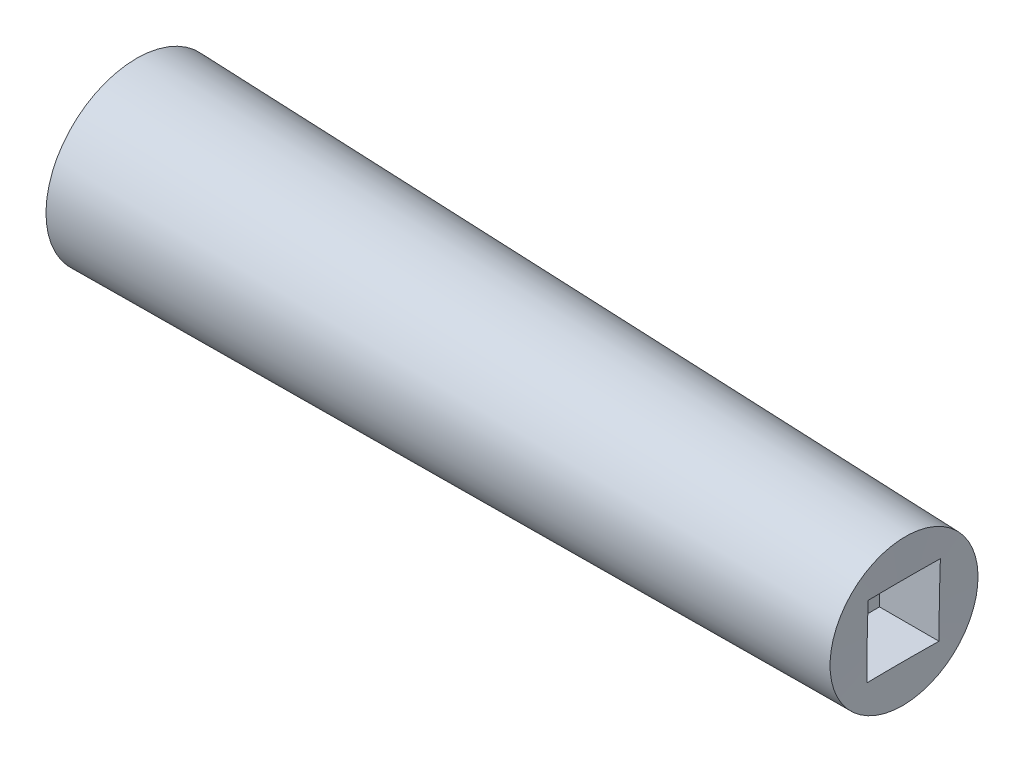
ISO-10303-21;
HEADER;
FILE_DESCRIPTION(('STEP AP214'),'2;1');
FILE_NAME('part.step','',(''),(''),'','','');
FILE_SCHEMA(('AUTOMOTIVE_DESIGN { 1 0 10303 214 1 1 1 1 }'));
ENDSEC;
DATA;
#1=APPLICATION_CONTEXT('core data for automotive mechanical design processes');
#2=APPLICATION_PROTOCOL_DEFINITION('international standard','automotive_design',2000,#1);
#3=PRODUCT_CONTEXT('',#1,'mechanical');
#4=PRODUCT('Part','Part','',(#3));
#5=PRODUCT_RELATED_PRODUCT_CATEGORY('part','',(#4));
#6=PRODUCT_DEFINITION_FORMATION('','',#4);
#7=PRODUCT_DEFINITION_CONTEXT('part definition',#1,'design');
#8=PRODUCT_DEFINITION('design','',#6,#7);
#9=PRODUCT_DEFINITION_SHAPE('','',#8);
#10=(LENGTH_UNIT() NAMED_UNIT(*) SI_UNIT(.MILLI.,.METRE.));
#11=(NAMED_UNIT(*) PLANE_ANGLE_UNIT() SI_UNIT($,.RADIAN.));
#12=(NAMED_UNIT(*) SI_UNIT($,.STERADIAN.) SOLID_ANGLE_UNIT());
#13=UNCERTAINTY_MEASURE_WITH_UNIT(LENGTH_MEASURE(1.E-05),#10,'distance_accuracy_value','');
#14=(GEOMETRIC_REPRESENTATION_CONTEXT(3) GLOBAL_UNCERTAINTY_ASSIGNED_CONTEXT((#13)) GLOBAL_UNIT_ASSIGNED_CONTEXT((#10,
#11,#12)) REPRESENTATION_CONTEXT('',''));
#15=CARTESIAN_POINT('',(0.,0.,0.));
#16=DIRECTION('',(0.,0.,1.));
#17=DIRECTION('',(1.,0.,0.));
#18=AXIS2_PLACEMENT_3D('',#15,#16,#17);
#19=CARTESIAN_POINT('',(13.0615157116451,18.7988170055453,0.));
#20=DIRECTION('',(-0.999815140029847,0.0192272142313432,0.));
#21=DIRECTION('',(-0.0192272142313432,-0.999815140029847,0.));
#22=AXIS2_PLACEMENT_3D('',#19,#20,#21);
#23=CONICAL_SURFACE('',#22,18.8022927968305,0.0192283990997072);
#24=CARTESIAN_POINT('',(165.405175600739,15.8691312384473,0.));
#25=DIRECTION('',(-0.999815140029847,0.0192272142313432,0.));
#26=DIRECTION('',(-0.0192272142313432,-0.999815140029847,0.));
#27=AXIS2_PLACEMENT_3D('',#24,#25,#26);
#28=CIRCLE('',#27,15.8720653479738);
#29=CARTESIAN_POINT('',(165.1,0.,0.));
#30=VERTEX_POINT('',#29);
#31=EDGE_CURVE('E113',#30,#30,#28,.T.);
#32=ORIENTED_EDGE('',*,*,#31,.T.);
#33=EDGE_LOOP('',(#32));
#34=FACE_BOUND('',#33,.T.);
#35=CARTESIAN_POINT('',(0.366210720887246,19.0429574861368,0.));
#36=DIRECTION('',(-0.999815140029847,0.0192272142313432,0.));
#37=DIRECTION('',(-0.0192272142313432,-0.999815140029847,0.));
#38=AXIS2_PLACEMENT_3D('',#35,#36,#37);
#39=CIRCLE('',#38,19.0464784175686);
#40=CARTESIAN_POINT('',(0.,0.,0.));
#41=VERTEX_POINT('',#40);
#42=EDGE_CURVE('E106',#41,#41,#39,.T.);
#43=ORIENTED_EDGE('',*,*,#42,.F.);
#44=EDGE_LOOP('',(#43));
#45=FACE_BOUND('',#44,.T.);
#46=ADVANCED_FACE('F36',(#34,#45),#23,.T.);
#47=CARTESIAN_POINT('',(165.405175600739,15.8691312384473,0.));
#48=DIRECTION('',(0.999815140029847,-0.0192272142313432,0.));
#49=DIRECTION('',(0.0192272142313432,0.999815140029847,0.));
#50=AXIS2_PLACEMENT_3D('',#47,#48,#49);
#51=CONICAL_SURFACE('',#50,15.8720653479738,1.55156792769519);
#52=CARTESIAN_POINT('',(166.018849805551,39.1282170446555,7.747));
#53=CARTESIAN_POINT('',(165.982531356894,38.1591925339244,7.747));
#54=CARTESIAN_POINT('',(165.946304161902,37.1901645619328,7.747));
#55=CARTESIAN_POINT('',(165.87416919061,35.2520958423405,7.747));
#56=CARTESIAN_POINT('',(165.838261414605,34.2830550947289,7.747));
#57=CARTESIAN_POINT('',(165.766898690176,32.3448597986069,7.747));
#58=CARTESIAN_POINT('',(165.731443787419,31.3757052484113,7.747));
#59=CARTESIAN_POINT('',(165.661245617306,29.4373704209507,7.747));
#60=CARTESIAN_POINT('',(165.626502349875,28.4681901436885,7.747));
#61=CARTESIAN_POINT('',(165.55818467158,26.5299994722729,7.747));
#62=CARTESIAN_POINT('',(165.524610007751,25.560989087102,7.747));
#63=CARTESIAN_POINT('',(165.459447015803,23.6228981918804,7.747));
#64=CARTESIAN_POINT('',(165.427858693563,22.6538176816307,7.747));
#65=CARTESIAN_POINT('',(165.368207486761,20.715601559152,7.747));
#66=CARTESIAN_POINT('',(165.340144395903,19.7464659534707,7.747));
#67=CARTESIAN_POINT('',(165.302365576836,18.2926531580322,7.747));
#68=CARTESIAN_POINT('',(165.290491973593,17.8080323367282,7.747));
#69=CARTESIAN_POINT('',(165.268418384247,16.8387525743781,7.747));
#70=CARTESIAN_POINT('',(165.258218397394,16.3540936333492,7.747));
#71=CARTESIAN_POINT('',(165.239592983861,15.3852326599418,7.747));
#72=CARTESIAN_POINT('',(165.231165770511,14.901030661909,7.747));
#73=CARTESIAN_POINT('',(165.215981287853,13.9326004884951,7.747));
#74=CARTESIAN_POINT('',(165.20922401929,13.4483723131025,7.747));
#75=CARTESIAN_POINT('',(165.19110544967,11.99565453731,7.747));
#76=CARTESIAN_POINT('',(165.1818975077,11.0271383718433,7.747));
#77=CARTESIAN_POINT('',(165.16699942045,9.09002571292507,7.747));
#78=CARTESIAN_POINT('',(165.161309480961,8.12142921808858,7.747));
#79=CARTESIAN_POINT('',(165.151914593081,6.18422993214144,7.747));
#80=CARTESIAN_POINT('',(165.148209638824,5.21562714105785,7.747));
#81=CARTESIAN_POINT('',(165.14195969628,3.27820731900975,7.747));
#82=CARTESIAN_POINT('',(165.139414960613,2.30939028729585,7.747));
#83=CARTESIAN_POINT('',(165.135037231457,0.371754570600254,7.747));
#84=CARTESIAN_POINT('',(165.133204238045,-0.597064114381616,7.747));
#85=CARTESIAN_POINT('',(165.129995098875,-2.5346054074249,7.747));
#86=CARTESIAN_POINT('',(165.128618907492,-3.50332801541457,7.747));
#87=CARTESIAN_POINT('',(165.126186171466,-5.44077274719201,7.747));
#88=CARTESIAN_POINT('',(165.125129626529,-6.4094948709794,7.747));
#89=CARTESIAN_POINT('',(165.124164429064,-7.37821704465549,7.747));
#90=B_SPLINE_CURVE_WITH_KNOTS('',3,(#52,#53,#54,#55,#56,#57,#58,#59,#60,#61,#62,#63,#64,#65,#66,
#67,#68,#69,#70,#71,#72,#73,#74,#75,#76,#77,#78,#79,#80,#81,#82,#83,#84,#85,#86,#87,#88,#89),
.UNSPECIFIED.,.F.,.F.,(4,2,2,2,2,2,2,2,2,2,2,2,2,2,2,2,2,2,4),(0.,2.90911466287845,
5.81823200701258,8.7276404235391,11.637048526665,14.5458228676123,17.4546058175186,
20.3632184670255,21.8175147399799,23.2718103621473,24.7246331923625,26.1774566698674,
29.0831236815387,31.9889606483684,34.8947890267405,37.8012497991294,40.7077108848073,
43.6138815848794,46.5200496056683),.UNSPECIFIED.);
#91=CARTESIAN_POINT('',(165.459784969748,23.622,7.747));
#92=VERTEX_POINT('',#91);
#93=CARTESIAN_POINT('',(165.161713197643,8.128,7.747));
#94=VERTEX_POINT('',#93);
#95=EDGE_CURVE('E11',#92,#94,#90,.T.);
#96=ORIENTED_EDGE('',*,*,#95,.F.);
#97=CARTESIAN_POINT('',(165.720473229558,23.622,-23.2532170446555));
#98=CARTESIAN_POINT('',(165.702799313012,23.622,-22.2841170636395));
#99=CARTESIAN_POINT('',(165.685216807189,23.622,-21.3150153742993));
#100=CARTESIAN_POINT('',(165.650371757768,23.622,-19.3768053598041));
#101=CARTESIAN_POINT('',(165.633109214465,23.622,-18.4076970346439));
#102=CARTESIAN_POINT('',(165.599039559912,23.622,-16.4693753681857));
#103=CARTESIAN_POINT('',(165.582232494392,23.622,-15.5001620260801));
#104=CARTESIAN_POINT('',(165.54933109776,23.622,-13.5617232898498));
#105=CARTESIAN_POINT('',(165.533236766571,23.622,-12.5924978957263));
#106=CARTESIAN_POINT('',(165.502214554707,23.622,-10.6542392783097));
#107=CARTESIAN_POINT('',(165.487286420757,23.622,-9.68520605913599));
#108=CARTESIAN_POINT('',(165.459418913144,23.622,-7.74710769424563));
#109=CARTESIAN_POINT('',(165.446479545351,23.622,-6.77804254844316));
#110=CARTESIAN_POINT('',(165.42412791656,23.622,-4.83992490101733));
#111=CARTESIAN_POINT('',(165.414715449214,23.622,-3.8708724019723));
#112=CARTESIAN_POINT('',(165.404912617872,23.622,-2.41726730685441));
#113=CARTESIAN_POINT('',(165.402364320385,23.622,-1.93272955573348));
#114=CARTESIAN_POINT('',(165.39894064798,23.622,-0.963648136851231));
#115=CARTESIAN_POINT('',(165.398065272318,23.622,-0.479104469092653));
#116=CARTESIAN_POINT('',(165.398078342275,23.622,0.489756259816175));
#117=CARTESIAN_POINT('',(165.398965963289,23.622,0.974073320978135));
#118=CARTESIAN_POINT('',(165.402411328019,23.622,1.94270149611468));
#119=CARTESIAN_POINT('',(165.40496907248,23.622,2.42701261008652));
#120=CARTESIAN_POINT('',(165.414795448669,23.622,3.87993778314971));
#121=CARTESIAN_POINT('',(165.424217217619,23.622,4.84853698805781));
#122=CARTESIAN_POINT('',(165.44657859544,23.622,6.78574808585371));
#123=CARTESIAN_POINT('',(165.459518410089,23.622,7.75435997616851));
#124=CARTESIAN_POINT('',(165.487382434427,23.622,9.6915518819147));
#125=CARTESIAN_POINT('',(165.502306638247,23.622,10.6601318974319));
#126=CARTESIAN_POINT('',(165.533318800138,23.622,12.5974839357212));
#127=CARTESIAN_POINT('',(165.54940701088,23.622,13.5662559543831));
#128=CARTESIAN_POINT('',(165.58229505445,23.622,15.5037879577197));
#129=CARTESIAN_POINT('',(165.599094887355,23.622,16.4725479423931));
#130=CARTESIAN_POINT('',(165.633149483956,23.622,18.4099630467376));
#131=CARTESIAN_POINT('',(165.650404202026,23.622,19.3786181672145));
#132=CARTESIAN_POINT('',(165.685233240765,23.622,21.3159217757053));
#133=CARTESIAN_POINT('',(165.702807561138,23.622,22.2845702637244));
#134=CARTESIAN_POINT('',(165.720473229558,23.622,23.2532170446555));
#135=B_SPLINE_CURVE_WITH_KNOTS('',3,(#97,#98,#99,#100,#101,#102,#103,#104,#105,#106,#107,#108,
#109,#110,#111,#112,#113,#114,#115,#116,#117,#118,#119,#120,#121,#122,#123,#124,#125,#126,#127,
#128,#129,#130,#131,#132,#133,#134),.UNSPECIFIED.,.F.,.F.,(4,2,2,2,2,2,2,2,2,2,2,2,2,2,2,2,2,2,
4),(0.,2.90778345108463,5.81556957503333,8.72364657218509,11.6317232551731,14.5391665921017,
17.4466185103024,20.3539002960061,21.8075311589833,23.2611613742454,24.7141118451679,
26.1670629641478,29.0729852577307,31.9790775609768,34.8851612708204,37.7918777110979,
40.6985944645876,43.6050207721362,46.5114443976753),.UNSPECIFIED.);
#136=CARTESIAN_POINT('',(165.459784969748,23.622,-7.747));
#137=VERTEX_POINT('',#136);
#138=EDGE_CURVE('E48',#137,#92,#135,.T.);
#139=ORIENTED_EDGE('',*,*,#138,.F.);
#140=CARTESIAN_POINT('',(165.124164429064,-7.37821704465548,-7.747));
#141=CARTESIAN_POINT('',(165.125129860765,-6.40926835089565,-7.747));
#142=CARTESIAN_POINT('',(165.126186671263,-5.44031970700912,-7.747));
#143=CARTESIAN_POINT('',(165.128620118395,-3.50242193681598,-7.747));
#144=CARTESIAN_POINT('',(165.129996755325,-2.53347281050973,-7.747));
#145=CARTESIAN_POINT('',(165.133207083058,-0.595478410275705,-7.747));
#146=CARTESIAN_POINT('',(165.135040819539,0.373566863580233,-7.747));
#147=CARTESIAN_POINT('',(165.139420590609,2.31165575634447,-7.747));
#148=CARTESIAN_POINT('',(165.141966625122,3.28069937525294,-7.747));
#149=CARTESIAN_POINT('',(165.148220258211,5.21857226489531,-7.747));
#150=CARTESIAN_POINT('',(165.151927603868,6.18740153637971,-7.747));
#151=CARTESIAN_POINT('',(165.161329461608,8.12505376696358,-7.747));
#152=CARTESIAN_POINT('',(165.167023979558,9.09387672603595,-7.747));
#153=CARTESIAN_POINT('',(165.181935647776,11.031442247685,-7.747));
#154=CARTESIAN_POINT('',(165.191152591968,12.0001848116494,-7.747));
#155=CARTESIAN_POINT('',(165.209289456545,13.4532420834762,-7.747));
#156=CARTESIAN_POINT('',(165.216053622004,13.937583407092,-7.747));
#157=CARTESIAN_POINT('',(165.231253296063,14.9062398348101,-7.747));
#158=CARTESIAN_POINT('',(165.239688803918,15.3905549389238,-7.747));
#159=CARTESIAN_POINT('',(165.258327280634,16.3594156611724,-7.747));
#160=CARTESIAN_POINT('',(165.268531211981,16.8439612607914,-7.747));
#161=CARTESIAN_POINT('',(165.290611290168,17.8130143519647,-7.747));
#162=CARTESIAN_POINT('',(165.302487437757,18.2975218435019,-7.747));
#163=CARTESIAN_POINT('',(165.340271490895,19.7509946904769,-7.747));
#164=CARTESIAN_POINT('',(165.368334872426,20.7199037189991,-7.747));
#165=CARTESIAN_POINT('',(165.427982235643,22.6576667915901,-7.747));
#166=CARTESIAN_POINT('',(165.459566423339,23.6265208291191,-7.747));
#167=CARTESIAN_POINT('',(165.524718960661,25.5641588468385,-7.747));
#168=CARTESIAN_POINT('',(165.55828730441,26.5329428272278,-7.747));
#169=CARTESIAN_POINT('',(165.626591247678,28.4706806241529,-7.747));
#170=CARTESIAN_POINT('',(165.661327099862,29.4396344317168,-7.747));
#171=CARTESIAN_POINT('',(165.731509884572,31.3775163394542,-7.747));
#172=CARTESIAN_POINT('',(165.766956817175,32.346444439625,-7.747));
#173=CARTESIAN_POINT('',(165.838303306991,34.2841869177893,-7.747));
#174=CARTESIAN_POINT('',(165.87420281859,35.2530012974662,-7.747));
#175=CARTESIAN_POINT('',(165.946321081367,37.1906172863208,-7.747));
#176=CARTESIAN_POINT('',(165.98253983225,38.1594188955096,-7.747));
#177=CARTESIAN_POINT('',(166.018849805551,39.1282170446555,-7.747));
#178=B_SPLINE_CURVE_WITH_KNOTS('',3,(#140,#141,#142,#143,#144,#145,#146,#147,#148,#149,#150,
#151,#152,#153,#154,#155,#156,#157,#158,#159,#160,#161,#162,#163,#164,#165,#166,#167,#168,#169,
#170,#171,#172,#173,#174,#175,#176,#177),.UNSPECIFIED.,.F.,.F.,(4,2,2,2,2,2,2,2,2,2,2,2,2,2,2,2,
2,2,4),(0.,2.90684758147293,5.81369783765664,8.72083869276206,11.6279792341031,14.5344870740646,
17.4410034964141,20.3473499023172,21.8005130759186,23.2536756024006,24.7076315284709,
26.1615881055014,29.0695213610654,31.9776248555484,34.885719735028,37.7944480687543,
40.7031767154071,43.6116145034555,46.5200496056785),.UNSPECIFIED.);
#179=CARTESIAN_POINT('',(165.161713197643,8.128,-7.747));
#180=VERTEX_POINT('',#179);
#181=EDGE_CURVE('E123',#180,#137,#178,.T.);
#182=ORIENTED_EDGE('',*,*,#181,.F.);
#183=CARTESIAN_POINT('',(165.422401457453,8.12799999999999,23.2532170446555));
#184=CARTESIAN_POINT('',(165.404731664969,8.12799999999999,22.2843436669215));
#185=CARTESIAN_POINT('',(165.387153251953,8.12799999999999,21.31546858148));
#186=CARTESIAN_POINT('',(165.352316208008,8.12799999999999,19.3777117764583));
#187=CARTESIAN_POINT('',(165.335057577372,8.128,18.4088300568728));
#188=CARTESIAN_POINT('',(165.300995451659,8.128,16.4709616776658));
#189=CARTESIAN_POINT('',(165.28419200226,8.128,15.5019750172376));
#190=CARTESIAN_POINT('',(165.251297282157,8.128,13.56398965337));
#191=CARTESIAN_POINT('',(165.235206011376,8.128,12.594990949932));
#192=CARTESIAN_POINT('',(165.204188823402,8.128,10.6571856219823));
#193=CARTESIAN_POINT('',(165.189262653243,8.128,9.68837900158526));
#194=CARTESIAN_POINT('',(165.161396884152,8.128,7.75073386015178));
#195=CARTESIAN_POINT('',(165.148457291088,8.128,6.78189533902953));
#196=CARTESIAN_POINT('',(165.126100781482,8.128,4.84423096025353));
#197=CARTESIAN_POINT('',(165.116683658877,8.128,3.87540510517545));
#198=CARTESIAN_POINT('',(165.106869047533,8.128,2.42213996638606));
#199=CARTESIAN_POINT('',(165.104316023884,8.128,1.93771553227048));
#200=CARTESIAN_POINT('',(165.10088150049,8.128,0.968860732101441));
#201=CARTESIAN_POINT('',(165.1,8.128,0.484430366050722));
#202=CARTESIAN_POINT('',(165.1,8.128,-0.484430366050717));
#203=CARTESIAN_POINT('',(165.10088150049,8.128,-0.968860732101438));
#204=CARTESIAN_POINT('',(165.104316023884,8.128,-1.93771553227048));
#205=CARTESIAN_POINT('',(165.106869047533,8.128,-2.42213996638606));
#206=CARTESIAN_POINT('',(165.116683658877,8.128,-3.87540510517545));
#207=CARTESIAN_POINT('',(165.126100781482,8.128,-4.84423096025353));
#208=CARTESIAN_POINT('',(165.148457291088,8.128,-6.78189533902952));
#209=CARTESIAN_POINT('',(165.161396884152,8.128,-7.75073386015178));
#210=CARTESIAN_POINT('',(165.189262653243,8.128,-9.68837900158526));
#211=CARTESIAN_POINT('',(165.204188823402,8.128,-10.6571856219823));
#212=CARTESIAN_POINT('',(165.235206011376,8.128,-12.594990949932));
#213=CARTESIAN_POINT('',(165.251297282157,8.128,-13.56398965337));
#214=CARTESIAN_POINT('',(165.28419200226,8.128,-15.5019750172376));
#215=CARTESIAN_POINT('',(165.300995451659,8.128,-16.4709616776658));
#216=CARTESIAN_POINT('',(165.335057577372,8.128,-18.4088300568728));
#217=CARTESIAN_POINT('',(165.352316208008,8.12800000000001,-19.3777117764583));
#218=CARTESIAN_POINT('',(165.387153251953,8.12800000000001,-21.31546858148));
#219=CARTESIAN_POINT('',(165.404731664969,8.12800000000001,-22.2843436669215));
#220=CARTESIAN_POINT('',(165.422401457453,8.12800000000001,-23.2532170446555));
#221=B_SPLINE_CURVE_WITH_KNOTS('',3,(#183,#184,#185,#186,#187,#188,#189,#190,#191,#192,#193,
#194,#195,#196,#197,#198,#199,#200,#201,#202,#203,#204,#205,#206,#207,#208,#209,#210,#211,#212,
#213,#214,#215,#216,#217,#218,#219,#220),.UNSPECIFIED.,.F.,.F.,(4,2,2,2,2,2,2,2,2,2,2,2,2,2,2,2,
2,2,4),(0.,2.90710352859455,5.8142097346429,8.7216066010905,11.6290031538514,14.5357666864479,
17.4425388064262,20.3491408554541,21.8024318510958,23.2557221988442,24.7090125465927,
26.1623035422344,29.0689055912623,31.9756777112406,34.8824412438371,37.789837796598,
40.6972346630456,43.6043408690939,46.5114443976885),.UNSPECIFIED.);
#222=EDGE_CURVE('E116',#94,#180,#221,.T.);
#223=ORIENTED_EDGE('',*,*,#222,.F.);
#224=EDGE_LOOP('',(#96,#139,#182,#223));
#225=FACE_BOUND('',#224,.T.);
#226=ORIENTED_EDGE('',*,*,#31,.F.);
#227=EDGE_LOOP('',(#226));
#228=FACE_BOUND('',#227,.T.);
#229=ADVANCED_FACE('F129',(#225,#228),#51,.F.);
#230=CARTESIAN_POINT('',(0.,19.05,0.));
#231=DIRECTION('',(0.999815140029847,-0.0192272142313432,0.));
#232=DIRECTION('',(0.0192272142313432,0.999815140029847,0.));
#233=AXIS2_PLACEMENT_3D('',#230,#231,#232);
#234=CONICAL_SURFACE('',#233,0.,1.55156792769519);
#235=ORIENTED_EDGE('',*,*,#42,.T.);
#236=EDGE_LOOP('',(#235));
#237=FACE_BOUND('',#236,.T.);
#238=CARTESIAN_POINT('',(0.,19.05,0.));
#239=VERTEX_POINT('',#238);
#240=VERTEX_LOOP('',#239);
#241=FACE_BOUND('',#240,.T.);
#242=ADVANCED_FACE('F140',(#237,#241),#234,.T.);
#243=CARTESIAN_POINT('',(152.4,8.128,7.747));
#244=DIRECTION('',(0.,0.,1.));
#245=DIRECTION('',(1.,0.,0.));
#246=AXIS2_PLACEMENT_3D('',#243,#244,#245);
#247=PLANE('',#246);
#248=ORIENTED_EDGE('',*,*,#95,.T.);
#249=DIRECTION('',(1.,0.,0.));
#250=VECTOR('',#249,1.);
#251=CARTESIAN_POINT('',(152.4,8.128,7.747));
#252=LINE('',#251,#250);
#253=CARTESIAN_POINT('',(152.4,8.128,7.747));
#254=VERTEX_POINT('',#253);
#255=EDGE_CURVE('E55',#254,#94,#252,.T.);
#256=ORIENTED_EDGE('',*,*,#255,.F.);
#257=DIRECTION('',(0.,-1.,0.));
#258=VECTOR('',#257,1.);
#259=CARTESIAN_POINT('',(152.4,8.128,7.747));
#260=LINE('',#259,#258);
#261=CARTESIAN_POINT('',(152.4,23.622,7.747));
#262=VERTEX_POINT('',#261);
#263=EDGE_CURVE('E82',#262,#254,#260,.T.);
#264=ORIENTED_EDGE('',*,*,#263,.F.);
#265=DIRECTION('',(1.,0.,0.));
#266=VECTOR('',#265,1.);
#267=CARTESIAN_POINT('',(152.4,23.622,7.747));
#268=LINE('',#267,#266);
#269=EDGE_CURVE('E104',#262,#92,#268,.T.);
#270=ORIENTED_EDGE('',*,*,#269,.T.);
#271=EDGE_LOOP('',(#248,#256,#264,#270));
#272=FACE_BOUND('',#271,.T.);
#273=ADVANCED_FACE('F79',(#272),#247,.F.);
#274=CARTESIAN_POINT('',(152.4,23.622,-7.747));
#275=DIRECTION('',(0.,1.,0.));
#276=DIRECTION('',(0.,0.,1.));
#277=AXIS2_PLACEMENT_3D('',#274,#275,#276);
#278=PLANE('',#277);
#279=ORIENTED_EDGE('',*,*,#138,.T.);
#280=ORIENTED_EDGE('',*,*,#269,.F.);
#281=DIRECTION('',(0.,0.,1.));
#282=VECTOR('',#281,1.);
#283=CARTESIAN_POINT('',(152.4,23.622,-7.747));
#284=LINE('',#283,#282);
#285=CARTESIAN_POINT('',(152.4,23.622,-7.747));
#286=VERTEX_POINT('',#285);
#287=EDGE_CURVE('E87',#286,#262,#284,.T.);
#288=ORIENTED_EDGE('',*,*,#287,.F.);
#289=DIRECTION('',(1.,0.,0.));
#290=VECTOR('',#289,1.);
#291=CARTESIAN_POINT('',(152.4,23.622,-7.747));
#292=LINE('',#291,#290);
#293=EDGE_CURVE('E107',#286,#137,#292,.T.);
#294=ORIENTED_EDGE('',*,*,#293,.T.);
#295=EDGE_LOOP('',(#279,#280,#288,#294));
#296=FACE_BOUND('',#295,.T.);
#297=ADVANCED_FACE('F139',(#296),#278,.F.);
#298=CARTESIAN_POINT('',(152.4,8.128,-7.747));
#299=DIRECTION('',(0.,0.,-1.));
#300=DIRECTION('',(-1.,0.,0.));
#301=AXIS2_PLACEMENT_3D('',#298,#299,#300);
#302=PLANE('',#301);
#303=ORIENTED_EDGE('',*,*,#181,.T.);
#304=ORIENTED_EDGE('',*,*,#293,.F.);
#305=DIRECTION('',(0.,1.,0.));
#306=VECTOR('',#305,1.);
#307=CARTESIAN_POINT('',(152.4,8.128,-7.747));
#308=LINE('',#307,#306);
#309=CARTESIAN_POINT('',(152.4,8.128,-7.747));
#310=VERTEX_POINT('',#309);
#311=EDGE_CURVE('E96',#310,#286,#308,.T.);
#312=ORIENTED_EDGE('',*,*,#311,.F.);
#313=DIRECTION('',(1.,0.,0.));
#314=VECTOR('',#313,1.);
#315=CARTESIAN_POINT('',(152.4,8.128,-7.747));
#316=LINE('',#315,#314);
#317=EDGE_CURVE('E86',#310,#180,#316,.T.);
#318=ORIENTED_EDGE('',*,*,#317,.T.);
#319=EDGE_LOOP('',(#303,#304,#312,#318));
#320=FACE_BOUND('',#319,.T.);
#321=ADVANCED_FACE('F134',(#320),#302,.F.);
#322=CARTESIAN_POINT('',(152.4,8.128,-7.747));
#323=DIRECTION('',(0.,-1.,0.));
#324=DIRECTION('',(0.,0.,-1.));
#325=AXIS2_PLACEMENT_3D('',#322,#323,#324);
#326=PLANE('',#325);
#327=ORIENTED_EDGE('',*,*,#222,.T.);
#328=ORIENTED_EDGE('',*,*,#317,.F.);
#329=DIRECTION('',(0.,0.,-1.));
#330=VECTOR('',#329,1.);
#331=CARTESIAN_POINT('',(152.4,8.128,-7.747));
#332=LINE('',#331,#330);
#333=EDGE_CURVE('E90',#254,#310,#332,.T.);
#334=ORIENTED_EDGE('',*,*,#333,.F.);
#335=ORIENTED_EDGE('',*,*,#255,.T.);
#336=EDGE_LOOP('',(#327,#328,#334,#335));
#337=FACE_BOUND('',#336,.T.);
#338=ADVANCED_FACE('F91',(#337),#326,.F.);
#339=CARTESIAN_POINT('',(152.4,0.,0.));
#340=DIRECTION('',(1.,0.,0.));
#341=DIRECTION('',(0.,0.,-1.));
#342=AXIS2_PLACEMENT_3D('',#339,#340,#341);
#343=PLANE('',#342);
#344=ORIENTED_EDGE('',*,*,#263,.T.);
#345=ORIENTED_EDGE('',*,*,#333,.T.);
#346=ORIENTED_EDGE('',*,*,#311,.T.);
#347=ORIENTED_EDGE('',*,*,#287,.T.);
#348=EDGE_LOOP('',(#344,#345,#346,#347));
#349=FACE_BOUND('',#348,.T.);
#350=ADVANCED_FACE('F98',(#349),#343,.T.);
#351=CLOSED_SHELL('',(#46,#229,#242,#273,#297,#321,#338,#350));
#352=MANIFOLD_SOLID_BREP('B2',#351);
#353=ADVANCED_BREP_SHAPE_REPRESENTATION('',(#18,#352),#14);
#354=SHAPE_DEFINITION_REPRESENTATION(#9,#353);
ENDSEC;
END-ISO-10303-21;
